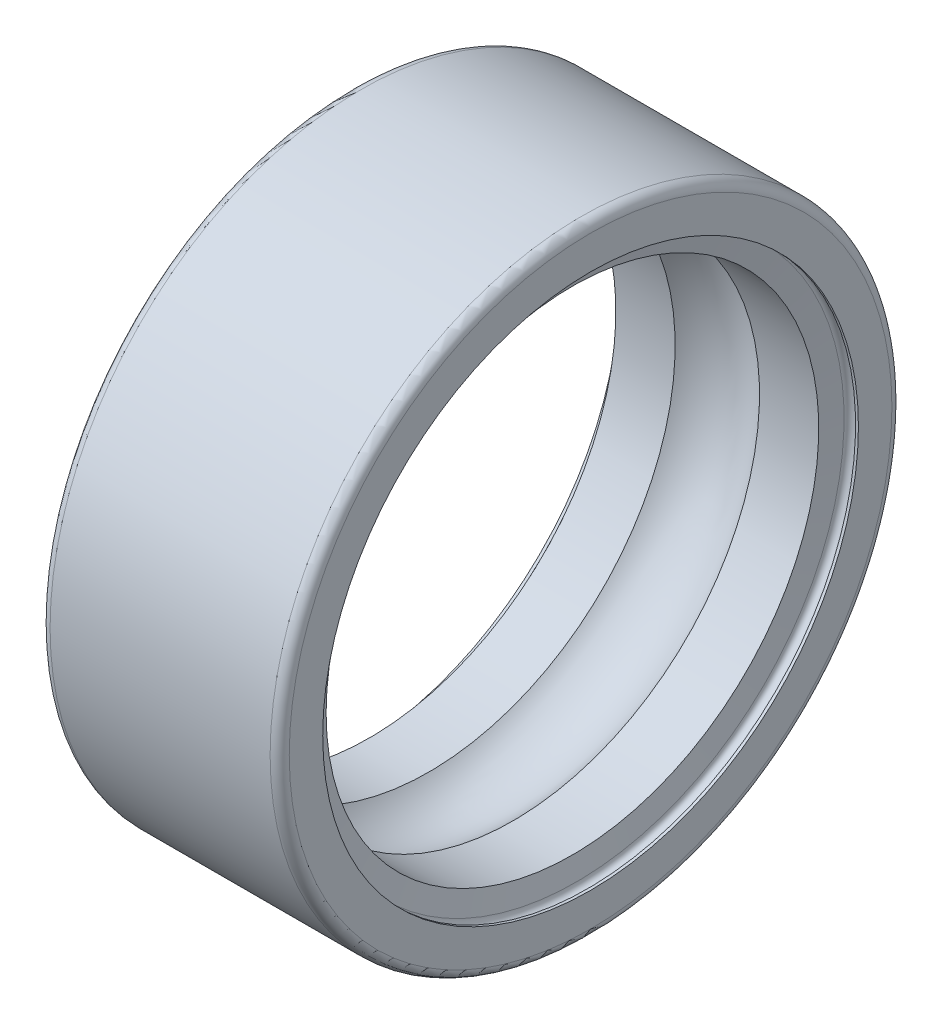
ISO-10303-21;
HEADER;
FILE_DESCRIPTION(('STEP AP214'),'2;1');
FILE_NAME('part.step','',(''),(''),'','','');
FILE_SCHEMA(('AUTOMOTIVE_DESIGN { 1 0 10303 214 1 1 1 1 }'));
ENDSEC;
DATA;
#1=APPLICATION_CONTEXT('core data for automotive mechanical design processes');
#2=APPLICATION_PROTOCOL_DEFINITION('international standard','automotive_design',2000,#1);
#3=PRODUCT_CONTEXT('',#1,'mechanical');
#4=PRODUCT('Part','Part','',(#3));
#5=PRODUCT_RELATED_PRODUCT_CATEGORY('part','',(#4));
#6=PRODUCT_DEFINITION_FORMATION('','',#4);
#7=PRODUCT_DEFINITION_CONTEXT('part definition',#1,'design');
#8=PRODUCT_DEFINITION('design','',#6,#7);
#9=PRODUCT_DEFINITION_SHAPE('','',#8);
#10=(LENGTH_UNIT() NAMED_UNIT(*) SI_UNIT(.MILLI.,.METRE.));
#11=(NAMED_UNIT(*) PLANE_ANGLE_UNIT() SI_UNIT($,.RADIAN.));
#12=(NAMED_UNIT(*) SI_UNIT($,.STERADIAN.) SOLID_ANGLE_UNIT());
#13=UNCERTAINTY_MEASURE_WITH_UNIT(LENGTH_MEASURE(1.E-05),#10,'distance_accuracy_value','');
#14=(GEOMETRIC_REPRESENTATION_CONTEXT(3) GLOBAL_UNCERTAINTY_ASSIGNED_CONTEXT((#13)) GLOBAL_UNIT_ASSIGNED_CONTEXT((#10,
#11,#12)) REPRESENTATION_CONTEXT('',''));
#15=CARTESIAN_POINT('',(0.,0.,0.));
#16=DIRECTION('',(0.,0.,1.));
#17=DIRECTION('',(1.,0.,0.));
#18=AXIS2_PLACEMENT_3D('',#15,#16,#17);
#19=CARTESIAN_POINT('',(0.,-6.47214093325049,-6.3));
#20=DIRECTION('',(-1.,0.,0.));
#21=DIRECTION('',(0.,0.,1.));
#22=AXIS2_PLACEMENT_3D('',#19,#20,#21);
#23=PLANE('',#22);
#24=CARTESIAN_POINT('',(0.,0.,0.));
#25=DIRECTION('',(-1.,0.,0.));
#26=DIRECTION('',(0.,0.,-1.));
#27=AXIS2_PLACEMENT_3D('',#24,#25,#26);
#28=CIRCLE('',#27,6.30000000730005);
#29=CARTESIAN_POINT('',(0.,0.,-6.30000000730005));
#30=VERTEX_POINT('',#29);
#31=EDGE_CURVE('E62',#30,#30,#28,.F.);
#32=ORIENTED_EDGE('',*,*,#31,.F.);
#33=EDGE_LOOP('',(#32));
#34=FACE_BOUND('',#33,.T.);
#35=CARTESIAN_POINT('',(0.,0.,0.));
#36=DIRECTION('',(1.,0.,0.));
#37=DIRECTION('',(0.,0.,1.));
#38=AXIS2_PLACEMENT_3D('',#35,#36,#37);
#39=CIRCLE('',#38,5.6);
#40=CARTESIAN_POINT('',(0.,0.,5.6));
#41=VERTEX_POINT('',#40);
#42=EDGE_CURVE('E59',#41,#41,#39,.T.);
#43=ORIENTED_EDGE('',*,*,#42,.T.);
#44=EDGE_LOOP('',(#43));
#45=FACE_BOUND('',#44,.T.);
#46=ADVANCED_FACE('F15',(#34,#45),#23,.T.);
#47=CARTESIAN_POINT('',(5.,-6.47214093325049,6.3));
#48=DIRECTION('',(1.,0.,0.));
#49=DIRECTION('',(0.,0.,-1.));
#50=AXIS2_PLACEMENT_3D('',#47,#48,#49);
#51=PLANE('',#50);
#52=CARTESIAN_POINT('',(5.,0.,0.));
#53=DIRECTION('',(1.,0.,0.));
#54=DIRECTION('',(0.,0.,1.));
#55=AXIS2_PLACEMENT_3D('',#52,#53,#54);
#56=CIRCLE('',#55,6.30000011371841);
#57=CARTESIAN_POINT('',(5.,0.,6.30000011371841));
#58=VERTEX_POINT('',#57);
#59=EDGE_CURVE('E56',#58,#58,#56,.T.);
#60=ORIENTED_EDGE('',*,*,#59,.T.);
#61=EDGE_LOOP('',(#60));
#62=FACE_BOUND('',#61,.T.);
#63=CARTESIAN_POINT('',(5.,0.,0.));
#64=DIRECTION('',(-1.,0.,0.));
#65=DIRECTION('',(0.,0.,-1.));
#66=AXIS2_PLACEMENT_3D('',#63,#64,#65);
#67=CIRCLE('',#66,5.6);
#68=CARTESIAN_POINT('',(5.,0.,-5.6));
#69=VERTEX_POINT('',#68);
#70=EDGE_CURVE('E53',#69,#69,#67,.F.);
#71=ORIENTED_EDGE('',*,*,#70,.F.);
#72=EDGE_LOOP('',(#71));
#73=FACE_BOUND('',#72,.T.);
#74=ADVANCED_FACE('F70',(#62,#73),#51,.T.);
#75=CARTESIAN_POINT('',(50.,0.,0.));
#76=DIRECTION('',(1.,0.,0.));
#77=DIRECTION('',(0.,0.,1.));
#78=AXIS2_PLACEMENT_3D('',#75,#76,#77);
#79=CYLINDRICAL_SURFACE('',#78,5.6);
#80=CARTESIAN_POINT('',(0.0599999999999952,0.,0.));
#81=DIRECTION('',(1.,0.,0.));
#82=DIRECTION('',(0.,0.,1.));
#83=AXIS2_PLACEMENT_3D('',#80,#81,#82);
#84=CIRCLE('',#83,5.6);
#85=CARTESIAN_POINT('',(0.0599999999999952,0.,5.6));
#86=VERTEX_POINT('',#85);
#87=EDGE_CURVE('E50',#86,#86,#84,.T.);
#88=ORIENTED_EDGE('',*,*,#87,.T.);
#89=EDGE_LOOP('',(#88));
#90=FACE_BOUND('',#89,.T.);
#91=ORIENTED_EDGE('',*,*,#42,.F.);
#92=EDGE_LOOP('',(#91));
#93=FACE_BOUND('',#92,.T.);
#94=ADVANCED_FACE('F74',(#90,#93),#79,.F.);
#95=CARTESIAN_POINT('',(0.18,0.,0.));
#96=DIRECTION('',(1.,0.,0.));
#97=DIRECTION('',(0.,0.,1.));
#98=AXIS2_PLACEMENT_3D('',#95,#96,#97);
#99=TOROIDAL_SURFACE('',#98,5.6,0.12);
#100=ORIENTED_EDGE('',*,*,#87,.F.);
#101=EDGE_LOOP('',(#100));
#102=FACE_BOUND('',#101,.T.);
#103=CARTESIAN_POINT('',(0.3,0.,0.));
#104=DIRECTION('',(1.,0.,0.));
#105=DIRECTION('',(0.,0.,1.));
#106=AXIS2_PLACEMENT_3D('',#103,#104,#105);
#107=CIRCLE('',#106,5.6);
#108=CARTESIAN_POINT('',(0.3,0.,5.6));
#109=VERTEX_POINT('',#108);
#110=EDGE_CURVE('E47',#109,#109,#107,.T.);
#111=ORIENTED_EDGE('',*,*,#110,.T.);
#112=EDGE_LOOP('',(#111));
#113=FACE_BOUND('',#112,.T.);
#114=ADVANCED_FACE('F76',(#102,#113),#99,.F.);
#115=CARTESIAN_POINT('',(0.3,0.,0.));
#116=DIRECTION('',(-1.,0.,0.));
#117=DIRECTION('',(0.,0.,-1.));
#118=AXIS2_PLACEMENT_3D('',#115,#116,#117);
#119=CONICAL_SURFACE('',#118,5.6,1.39626340159546);
#120=ORIENTED_EDGE('',*,*,#110,.F.);
#121=EDGE_LOOP('',(#120));
#122=FACE_BOUND('',#121,.T.);
#123=CARTESIAN_POINT('',(0.379347141318811,0.,0.));
#124=DIRECTION('',(1.,0.,0.));
#125=DIRECTION('',(0.,0.,1.));
#126=AXIS2_PLACEMENT_3D('',#123,#124,#125);
#127=CIRCLE('',#126,5.15);
#128=CARTESIAN_POINT('',(0.379347141318811,0.,5.15));
#129=VERTEX_POINT('',#128);
#130=EDGE_CURVE('E44',#129,#129,#127,.T.);
#131=ORIENTED_EDGE('',*,*,#130,.T.);
#132=EDGE_LOOP('',(#131));
#133=FACE_BOUND('',#132,.T.);
#134=ADVANCED_FACE('F84',(#122,#133),#119,.F.);
#135=CARTESIAN_POINT('',(50.,0.,0.));
#136=DIRECTION('',(1.,0.,0.));
#137=DIRECTION('',(0.,0.,1.));
#138=AXIS2_PLACEMENT_3D('',#135,#136,#137);
#139=CYLINDRICAL_SURFACE('',#138,5.15);
#140=CARTESIAN_POINT('',(1.61835934190849,0.,0.));
#141=DIRECTION('',(1.,0.,0.));
#142=DIRECTION('',(0.,-1.92333137964543E-10,1.));
#143=AXIS2_PLACEMENT_3D('',#140,#141,#142);
#144=CIRCLE('',#143,5.15);
#145=CARTESIAN_POINT('',(1.61835934190849,-9.90515660517396E-10,5.15));
#146=VERTEX_POINT('',#145);
#147=EDGE_CURVE('E41',#146,#146,#144,.T.);
#148=ORIENTED_EDGE('',*,*,#147,.T.);
#149=EDGE_LOOP('',(#148));
#150=FACE_BOUND('',#149,.T.);
#151=ORIENTED_EDGE('',*,*,#130,.F.);
#152=EDGE_LOOP('',(#151));
#153=FACE_BOUND('',#152,.T.);
#154=ADVANCED_FACE('F92',(#150,#153),#139,.F.);
#155=CARTESIAN_POINT('',(2.5,0.,0.));
#156=DIRECTION('',(1.,0.,0.));
#157=DIRECTION('',(0.,0.,1.));
#158=AXIS2_PLACEMENT_3D('',#155,#156,#157);
#159=TOROIDAL_SURFACE('',#158,4.35,1.19050000000002);
#160=ORIENTED_EDGE('',*,*,#147,.F.);
#161=EDGE_LOOP('',(#160));
#162=FACE_BOUND('',#161,.T.);
#163=CARTESIAN_POINT('',(3.38164065809151,0.,0.));
#164=DIRECTION('',(1.,0.,0.));
#165=DIRECTION('',(0.,-1.92332693875333E-10,1.));
#166=AXIS2_PLACEMENT_3D('',#163,#164,#165);
#167=CIRCLE('',#166,5.15000000000001);
#168=CARTESIAN_POINT('',(3.38164065809151,-9.90513373457966E-10,5.15000000000001));
#169=VERTEX_POINT('',#168);
#170=EDGE_CURVE('E38',#169,#169,#167,.T.);
#171=ORIENTED_EDGE('',*,*,#170,.T.);
#172=EDGE_LOOP('',(#171));
#173=FACE_BOUND('',#172,.T.);
#174=ADVANCED_FACE('F96',(#162,#173),#159,.F.);
#175=CARTESIAN_POINT('',(50.,0.,0.));
#176=DIRECTION('',(1.,0.,0.));
#177=DIRECTION('',(0.,0.,1.));
#178=AXIS2_PLACEMENT_3D('',#175,#176,#177);
#179=CYLINDRICAL_SURFACE('',#178,5.15);
#180=CARTESIAN_POINT('',(4.6206528586812,0.,0.));
#181=DIRECTION('',(1.,0.,0.));
#182=DIRECTION('',(0.,-1.92332693875333E-10,1.));
#183=AXIS2_PLACEMENT_3D('',#180,#181,#182);
#184=CIRCLE('',#183,5.15);
#185=CARTESIAN_POINT('',(4.6206528586812,-9.90513373457965E-10,5.15));
#186=VERTEX_POINT('',#185);
#187=EDGE_CURVE('E35',#186,#186,#184,.T.);
#188=ORIENTED_EDGE('',*,*,#187,.T.);
#189=EDGE_LOOP('',(#188));
#190=FACE_BOUND('',#189,.T.);
#191=ORIENTED_EDGE('',*,*,#170,.F.);
#192=EDGE_LOOP('',(#191));
#193=FACE_BOUND('',#192,.T.);
#194=ADVANCED_FACE('F100',(#190,#193),#179,.F.);
#195=CARTESIAN_POINT('',(4.7,0.,0.));
#196=DIRECTION('',(1.,0.,0.));
#197=DIRECTION('',(0.,0.,1.));
#198=AXIS2_PLACEMENT_3D('',#195,#196,#197);
#199=CONICAL_SURFACE('',#198,5.6,1.39626340159547);
#200=CARTESIAN_POINT('',(4.7,0.,0.));
#201=DIRECTION('',(1.,0.,0.));
#202=DIRECTION('',(0.,0.,1.));
#203=AXIS2_PLACEMENT_3D('',#200,#201,#202);
#204=CIRCLE('',#203,5.6);
#205=CARTESIAN_POINT('',(4.7,0.,5.6));
#206=VERTEX_POINT('',#205);
#207=EDGE_CURVE('E30',#206,#206,#204,.T.);
#208=ORIENTED_EDGE('',*,*,#207,.T.);
#209=EDGE_LOOP('',(#208));
#210=FACE_BOUND('',#209,.T.);
#211=ORIENTED_EDGE('',*,*,#187,.F.);
#212=EDGE_LOOP('',(#211));
#213=FACE_BOUND('',#212,.T.);
#214=ADVANCED_FACE('F104',(#210,#213),#199,.F.);
#215=CARTESIAN_POINT('',(4.82,0.,0.));
#216=DIRECTION('',(1.,0.,0.));
#217=DIRECTION('',(0.,0.,1.));
#218=AXIS2_PLACEMENT_3D('',#215,#216,#217);
#219=TOROIDAL_SURFACE('',#218,5.6,0.12);
#220=ORIENTED_EDGE('',*,*,#207,.F.);
#221=EDGE_LOOP('',(#220));
#222=FACE_BOUND('',#221,.T.);
#223=CARTESIAN_POINT('',(4.94,0.,0.));
#224=DIRECTION('',(1.,0.,0.));
#225=DIRECTION('',(0.,0.,1.));
#226=AXIS2_PLACEMENT_3D('',#223,#224,#225);
#227=CIRCLE('',#226,5.6);
#228=CARTESIAN_POINT('',(4.94,0.,5.6));
#229=VERTEX_POINT('',#228);
#230=EDGE_CURVE('E26',#229,#229,#227,.T.);
#231=ORIENTED_EDGE('',*,*,#230,.T.);
#232=EDGE_LOOP('',(#231));
#233=FACE_BOUND('',#232,.T.);
#234=ADVANCED_FACE('F108',(#222,#233),#219,.F.);
#235=CARTESIAN_POINT('',(50.,0.,0.));
#236=DIRECTION('',(1.,0.,0.));
#237=DIRECTION('',(0.,0.,1.));
#238=AXIS2_PLACEMENT_3D('',#235,#236,#237);
#239=CYLINDRICAL_SURFACE('',#238,5.6);
#240=ORIENTED_EDGE('',*,*,#70,.T.);
#241=EDGE_LOOP('',(#240));
#242=FACE_BOUND('',#241,.T.);
#243=ORIENTED_EDGE('',*,*,#230,.F.);
#244=EDGE_LOOP('',(#243));
#245=FACE_BOUND('',#244,.T.);
#246=ADVANCED_FACE('F112',(#242,#245),#239,.F.);
#247=CARTESIAN_POINT('',(4.8,0.,0.));
#248=DIRECTION('',(1.,0.,0.));
#249=DIRECTION('',(0.,0.,1.));
#250=AXIS2_PLACEMENT_3D('',#247,#248,#249);
#251=TOROIDAL_SURFACE('',#250,6.3,0.200000000000033);
#252=CARTESIAN_POINT('',(4.8,0.,0.));
#253=DIRECTION('',(1.,0.,0.));
#254=DIRECTION('',(0.,0.,1.));
#255=AXIS2_PLACEMENT_3D('',#252,#253,#254);
#256=CIRCLE('',#255,6.50000000000003);
#257=CARTESIAN_POINT('',(4.8,0.,6.50000000000003));
#258=VERTEX_POINT('',#257);
#259=EDGE_CURVE('E22',#258,#258,#256,.T.);
#260=ORIENTED_EDGE('',*,*,#259,.T.);
#261=EDGE_LOOP('',(#260));
#262=FACE_BOUND('',#261,.T.);
#263=ORIENTED_EDGE('',*,*,#59,.F.);
#264=EDGE_LOOP('',(#263));
#265=FACE_BOUND('',#264,.T.);
#266=ADVANCED_FACE('F116',(#262,#265),#251,.T.);
#267=CARTESIAN_POINT('',(50.,0.,0.));
#268=DIRECTION('',(1.,0.,0.));
#269=DIRECTION('',(0.,0.,1.));
#270=AXIS2_PLACEMENT_3D('',#267,#268,#269);
#271=CYLINDRICAL_SURFACE('',#270,6.5);
#272=CARTESIAN_POINT('',(0.20000000000001,0.,0.));
#273=DIRECTION('',(1.,0.,0.));
#274=DIRECTION('',(0.,-1.92328252983234E-10,1.));
#275=AXIS2_PLACEMENT_3D('',#272,#273,#274);
#276=CIRCLE('',#275,6.5);
#277=CARTESIAN_POINT('',(0.20000000000001,-1.25013364439102E-09,6.5));
#278=VERTEX_POINT('',#277);
#279=EDGE_CURVE('E10',#278,#278,#276,.T.);
#280=ORIENTED_EDGE('',*,*,#279,.T.);
#281=EDGE_LOOP('',(#280));
#282=FACE_BOUND('',#281,.T.);
#283=ORIENTED_EDGE('',*,*,#259,.F.);
#284=EDGE_LOOP('',(#283));
#285=FACE_BOUND('',#284,.T.);
#286=ADVANCED_FACE('F119',(#282,#285),#271,.T.);
#287=CARTESIAN_POINT('',(0.200000000000018,0.,0.));
#288=DIRECTION('',(1.,0.,0.));
#289=DIRECTION('',(0.,0.,1.));
#290=AXIS2_PLACEMENT_3D('',#287,#288,#289);
#291=TOROIDAL_SURFACE('',#290,6.3,0.200000000000018);
#292=ORIENTED_EDGE('',*,*,#31,.T.);
#293=EDGE_LOOP('',(#292));
#294=FACE_BOUND('',#293,.T.);
#295=ORIENTED_EDGE('',*,*,#279,.F.);
#296=EDGE_LOOP('',(#295));
#297=FACE_BOUND('',#296,.T.);
#298=ADVANCED_FACE('F17',(#294,#297),#291,.T.);
#299=CLOSED_SHELL('',(#46,#74,#94,#114,#134,#154,#174,#194,#214,#234,#246,#266,#286,#298));
#300=MANIFOLD_SOLID_BREP('B1',#299);
#301=ADVANCED_BREP_SHAPE_REPRESENTATION('',(#18,#300),#14);
#302=SHAPE_DEFINITION_REPRESENTATION(#9,#301);
ENDSEC;
END-ISO-10303-21;
